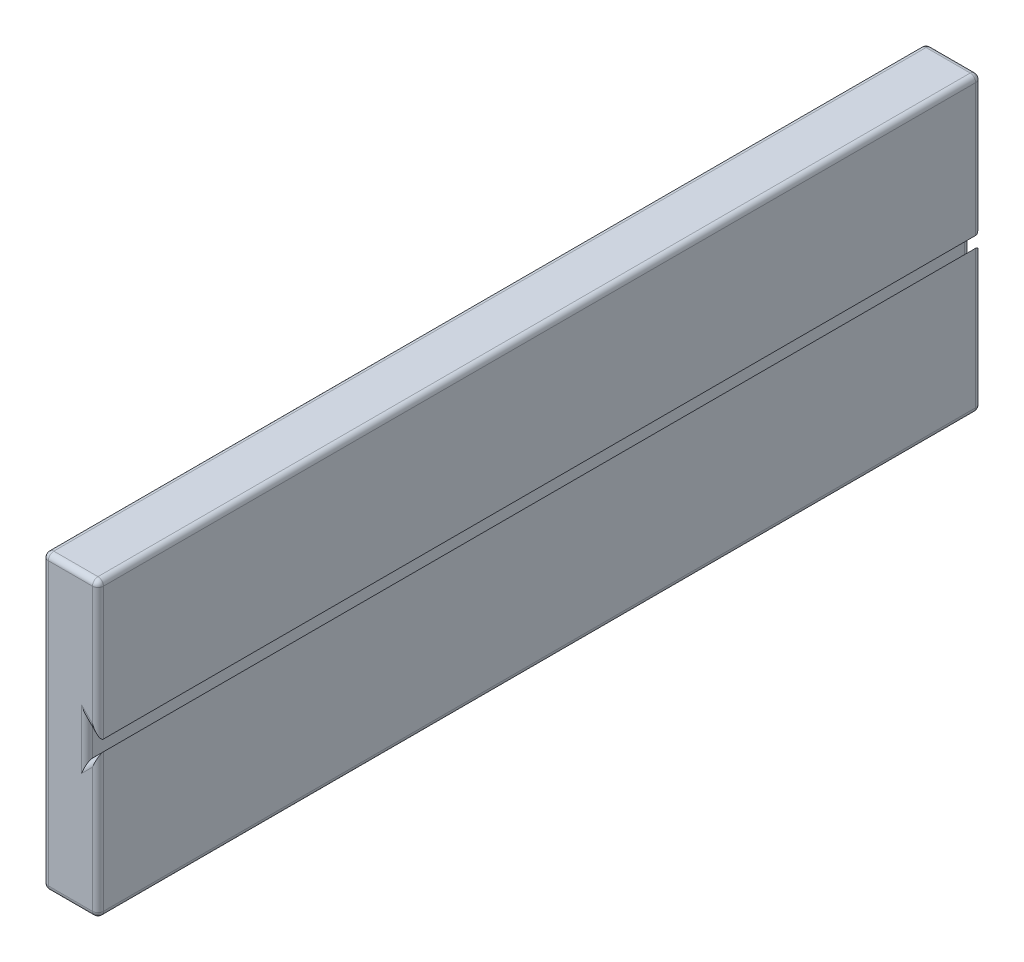
ISO-10303-21;
HEADER;
FILE_DESCRIPTION(('STEP AP214'),'2;1');
FILE_NAME('part.step','',(''),(''),'','','');
FILE_SCHEMA(('AUTOMOTIVE_DESIGN { 1 0 10303 214 1 1 1 1 }'));
ENDSEC;
DATA;
#1=APPLICATION_CONTEXT('core data for automotive mechanical design processes');
#2=APPLICATION_PROTOCOL_DEFINITION('international standard','automotive_design',2000,#1);
#3=PRODUCT_CONTEXT('',#1,'mechanical');
#4=PRODUCT('Part','Part','',(#3));
#5=PRODUCT_RELATED_PRODUCT_CATEGORY('part','',(#4));
#6=PRODUCT_DEFINITION_FORMATION('','',#4);
#7=PRODUCT_DEFINITION_CONTEXT('part definition',#1,'design');
#8=PRODUCT_DEFINITION('design','',#6,#7);
#9=PRODUCT_DEFINITION_SHAPE('','',#8);
#10=(LENGTH_UNIT() NAMED_UNIT(*) SI_UNIT(.MILLI.,.METRE.));
#11=(NAMED_UNIT(*) PLANE_ANGLE_UNIT() SI_UNIT($,.RADIAN.));
#12=(NAMED_UNIT(*) SI_UNIT($,.STERADIAN.) SOLID_ANGLE_UNIT());
#13=UNCERTAINTY_MEASURE_WITH_UNIT(LENGTH_MEASURE(1.E-05),#10,'distance_accuracy_value','');
#14=(GEOMETRIC_REPRESENTATION_CONTEXT(3) GLOBAL_UNCERTAINTY_ASSIGNED_CONTEXT((#13)) GLOBAL_UNIT_ASSIGNED_CONTEXT((#10,
#11,#12)) REPRESENTATION_CONTEXT('',''));
#15=CARTESIAN_POINT('',(0.,0.,0.));
#16=DIRECTION('',(0.,0.,1.));
#17=DIRECTION('',(1.,0.,0.));
#18=AXIS2_PLACEMENT_3D('',#15,#16,#17);
#19=CARTESIAN_POINT('',(10.,0.,0.));
#20=DIRECTION('',(-1.,0.,0.));
#21=DIRECTION('',(0.,0.,1.));
#22=AXIS2_PLACEMENT_3D('',#19,#20,#21);
#23=PLANE('',#22);
#24=DIRECTION('',(0.,0.,-1.));
#25=VECTOR('',#24,1.);
#26=CARTESIAN_POINT('',(10.,1.,0.));
#27=LINE('',#26,#25);
#28=CARTESIAN_POINT('',(10.,1.,-1.));
#29=VERTEX_POINT('',#28);
#30=CARTESIAN_POINT('',(10.,1.,-159.));
#31=VERTEX_POINT('',#30);
#32=EDGE_CURVE('E176',#29,#31,#27,.T.);
#33=ORIENTED_EDGE('',*,*,#32,.T.);
#34=DIRECTION('',(0.,1.,0.));
#35=VECTOR('',#34,1.);
#36=CARTESIAN_POINT('',(10.,0.,-159.));
#37=LINE('',#36,#35);
#38=CARTESIAN_POINT('',(10.,26.0254427708585,-159.));
#39=VERTEX_POINT('',#38);
#40=EDGE_CURVE('E171',#31,#39,#37,.T.);
#41=ORIENTED_EDGE('',*,*,#40,.T.);
#42=DIRECTION('',(0.,0.,1.));
#43=VECTOR('',#42,1.);
#44=CARTESIAN_POINT('',(10.,26.0254427708585,0.));
#45=LINE('',#44,#43);
#46=CARTESIAN_POINT('',(10.,26.0254427708585,-1.));
#47=VERTEX_POINT('',#46);
#48=EDGE_CURVE('E173',#39,#47,#45,.T.);
#49=ORIENTED_EDGE('',*,*,#48,.T.);
#50=DIRECTION('',(0.,-1.,0.));
#51=VECTOR('',#50,1.);
#52=CARTESIAN_POINT('',(10.,0.,-1.));
#53=LINE('',#52,#51);
#54=EDGE_CURVE('E190',#47,#29,#53,.T.);
#55=ORIENTED_EDGE('',*,*,#54,.T.);
#56=EDGE_LOOP('',(#33,#41,#49,#55));
#57=FACE_BOUND('',#56,.T.);
#58=ADVANCED_FACE('F34',(#57),#23,.F.);
#59=CARTESIAN_POINT('',(10.,0.,0.));
#60=DIRECTION('',(0.,0.,-1.));
#61=DIRECTION('',(-1.,0.,0.));
#62=AXIS2_PLACEMENT_3D('',#59,#60,#61);
#63=PLANE('',#62);
#64=DIRECTION('',(0.,1.,0.));
#65=VECTOR('',#64,1.);
#66=CARTESIAN_POINT('',(7.,0.,0.));
#67=LINE('',#66,#65);
#68=CARTESIAN_POINT('',(7.,21.6112292084854,0.));
#69=VERTEX_POINT('',#68);
#70=CARTESIAN_POINT('',(7.,32.4396563332316,0.));
#71=VERTEX_POINT('',#70);
#72=EDGE_CURVE('E357',#69,#71,#67,.T.);
#73=ORIENTED_EDGE('',*,*,#72,.T.);
#74=DIRECTION('',(0.707106781186548,-0.707106781186547,0.));
#75=VECTOR('',#74,1.);
#76=CARTESIAN_POINT('',(24.7198281666158,14.7198281666158,0.));
#77=LINE('',#76,#75);
#78=CARTESIAN_POINT('',(9.,30.4396563332316,0.));
#79=VERTEX_POINT('',#78);
#80=EDGE_CURVE('E359',#71,#79,#77,.T.);
#81=ORIENTED_EDGE('',*,*,#80,.T.);
#82=DIRECTION('',(0.,-1.,0.));
#83=VECTOR('',#82,1.);
#84=CARTESIAN_POINT('',(9.,0.,0.));
#85=LINE('',#84,#83);
#86=CARTESIAN_POINT('',(9.,52.,0.));
#87=VERTEX_POINT('',#86);
#88=EDGE_CURVE('E346',#79,#87,#85,.F.);
#89=ORIENTED_EDGE('',*,*,#88,.T.);
#90=DIRECTION('',(-1.,0.,0.));
#91=VECTOR('',#90,1.);
#92=CARTESIAN_POINT('',(10.,52.,0.));
#93=LINE('',#92,#91);
#94=CARTESIAN_POINT('',(0.999999999999999,52.,0.));
#95=VERTEX_POINT('',#94);
#96=EDGE_CURVE('E344',#87,#95,#93,.T.);
#97=ORIENTED_EDGE('',*,*,#96,.T.);
#98=DIRECTION('',(0.,-1.,0.));
#99=VECTOR('',#98,1.);
#100=CARTESIAN_POINT('',(0.999999999999999,0.,0.));
#101=LINE('',#100,#99);
#102=CARTESIAN_POINT('',(0.999999999999999,1.,0.));
#103=VERTEX_POINT('',#102);
#104=EDGE_CURVE('E348',#95,#103,#101,.T.);
#105=ORIENTED_EDGE('',*,*,#104,.T.);
#106=DIRECTION('',(-1.,0.,0.));
#107=VECTOR('',#106,1.);
#108=CARTESIAN_POINT('',(10.,1.,0.));
#109=LINE('',#108,#107);
#110=CARTESIAN_POINT('',(9.,1.,0.));
#111=VERTEX_POINT('',#110);
#112=EDGE_CURVE('E350',#103,#111,#109,.F.);
#113=ORIENTED_EDGE('',*,*,#112,.T.);
#114=DIRECTION('',(0.,-1.,0.));
#115=VECTOR('',#114,1.);
#116=CARTESIAN_POINT('',(9.,0.,0.));
#117=LINE('',#116,#115);
#118=CARTESIAN_POINT('',(9.,23.6112292084854,0.));
#119=VERTEX_POINT('',#118);
#120=EDGE_CURVE('E353',#111,#119,#117,.F.);
#121=ORIENTED_EDGE('',*,*,#120,.T.);
#122=DIRECTION('',(-0.707106781186548,-0.707106781186547,0.));
#123=VECTOR('',#122,1.);
#124=CARTESIAN_POINT('',(-2.30561460424269,12.3056146042427,0.));
#125=LINE('',#124,#123);
#126=EDGE_CURVE('E355',#119,#69,#125,.T.);
#127=ORIENTED_EDGE('',*,*,#126,.T.);
#128=EDGE_LOOP('',(#73,#81,#89,#97,#105,#113,#121,#127));
#129=FACE_BOUND('',#128,.T.);
#130=ADVANCED_FACE('F461',(#129),#63,.F.);
#131=CARTESIAN_POINT('',(10.,0.,0.));
#132=DIRECTION('',(0.,1.,0.));
#133=DIRECTION('',(0.,0.,1.));
#134=AXIS2_PLACEMENT_3D('',#131,#132,#133);
#135=PLANE('',#134);
#136=DIRECTION('',(0.,0.,-1.));
#137=VECTOR('',#136,1.);
#138=CARTESIAN_POINT('',(0.999999999999999,0.,-160.));
#139=LINE('',#138,#137);
#140=CARTESIAN_POINT('',(0.999999999999999,0.,-1.));
#141=VERTEX_POINT('',#140);
#142=CARTESIAN_POINT('',(0.999999999999999,0.,-159.));
#143=VERTEX_POINT('',#142);
#144=EDGE_CURVE('E298',#141,#143,#139,.T.);
#145=ORIENTED_EDGE('',*,*,#144,.T.);
#146=DIRECTION('',(-1.,0.,0.));
#147=VECTOR('',#146,1.);
#148=CARTESIAN_POINT('',(10.,0.,-159.));
#149=LINE('',#148,#147);
#150=CARTESIAN_POINT('',(9.,0.,-159.));
#151=VERTEX_POINT('',#150);
#152=EDGE_CURVE('E303',#143,#151,#149,.F.);
#153=ORIENTED_EDGE('',*,*,#152,.T.);
#154=DIRECTION('',(0.,0.,-1.));
#155=VECTOR('',#154,1.);
#156=CARTESIAN_POINT('',(9.,0.,0.));
#157=LINE('',#156,#155);
#158=CARTESIAN_POINT('',(9.,0.,-1.));
#159=VERTEX_POINT('',#158);
#160=EDGE_CURVE('E300',#151,#159,#157,.F.);
#161=ORIENTED_EDGE('',*,*,#160,.T.);
#162=DIRECTION('',(-1.,0.,0.));
#163=VECTOR('',#162,1.);
#164=CARTESIAN_POINT('',(10.,0.,-1.));
#165=LINE('',#164,#163);
#166=EDGE_CURVE('E180',#159,#141,#165,.T.);
#167=ORIENTED_EDGE('',*,*,#166,.T.);
#168=EDGE_LOOP('',(#145,#153,#161,#167));
#169=FACE_BOUND('',#168,.T.);
#170=ADVANCED_FACE('F391',(#169),#135,.F.);
#171=CARTESIAN_POINT('',(10.,0.,-160.));
#172=DIRECTION('',(0.,0.,1.));
#173=DIRECTION('',(1.,0.,0.));
#174=AXIS2_PLACEMENT_3D('',#171,#172,#173);
#175=PLANE('',#174);
#176=DIRECTION('',(0.,1.,0.));
#177=VECTOR('',#176,1.);
#178=CARTESIAN_POINT('',(9.,0.,-160.));
#179=LINE('',#178,#177);
#180=CARTESIAN_POINT('',(9.,23.6112292084854,-160.));
#181=VERTEX_POINT('',#180);
#182=CARTESIAN_POINT('',(9.,1.,-160.));
#183=VERTEX_POINT('',#182);
#184=EDGE_CURVE('E205',#181,#183,#179,.F.);
#185=ORIENTED_EDGE('',*,*,#184,.T.);
#186=DIRECTION('',(-1.,0.,0.));
#187=VECTOR('',#186,1.);
#188=CARTESIAN_POINT('',(10.,1.,-160.));
#189=LINE('',#188,#187);
#190=CARTESIAN_POINT('',(0.999999999999999,1.,-160.));
#191=VERTEX_POINT('',#190);
#192=EDGE_CURVE('E328',#183,#191,#189,.T.);
#193=ORIENTED_EDGE('',*,*,#192,.T.);
#194=DIRECTION('',(0.,1.,0.));
#195=VECTOR('',#194,1.);
#196=CARTESIAN_POINT('',(0.999999999999999,53.,-160.));
#197=LINE('',#196,#195);
#198=CARTESIAN_POINT('',(0.999999999999999,52.,-160.));
#199=VERTEX_POINT('',#198);
#200=EDGE_CURVE('E316',#191,#199,#197,.T.);
#201=ORIENTED_EDGE('',*,*,#200,.T.);
#202=DIRECTION('',(-1.,0.,0.));
#203=VECTOR('',#202,1.);
#204=CARTESIAN_POINT('',(10.,52.,-160.));
#205=LINE('',#204,#203);
#206=CARTESIAN_POINT('',(9.,52.,-160.));
#207=VERTEX_POINT('',#206);
#208=EDGE_CURVE('E314',#199,#207,#205,.F.);
#209=ORIENTED_EDGE('',*,*,#208,.T.);
#210=DIRECTION('',(0.,1.,0.));
#211=VECTOR('',#210,1.);
#212=CARTESIAN_POINT('',(9.,0.,-160.));
#213=LINE('',#212,#211);
#214=CARTESIAN_POINT('',(9.,30.4396563332316,-160.));
#215=VERTEX_POINT('',#214);
#216=EDGE_CURVE('E318',#207,#215,#213,.F.);
#217=ORIENTED_EDGE('',*,*,#216,.T.);
#218=DIRECTION('',(-0.707106781186548,0.707106781186547,0.));
#219=VECTOR('',#218,1.);
#220=CARTESIAN_POINT('',(24.7198281666158,14.7198281666158,-160.));
#221=LINE('',#220,#219);
#222=CARTESIAN_POINT('',(7.,32.4396563332316,-160.));
#223=VERTEX_POINT('',#222);
#224=EDGE_CURVE('E320',#215,#223,#221,.T.);
#225=ORIENTED_EDGE('',*,*,#224,.T.);
#226=DIRECTION('',(0.,-1.,0.));
#227=VECTOR('',#226,1.);
#228=CARTESIAN_POINT('',(7.,0.,-160.));
#229=LINE('',#228,#227);
#230=CARTESIAN_POINT('',(7.,21.6112292084854,-160.));
#231=VERTEX_POINT('',#230);
#232=EDGE_CURVE('E323',#223,#231,#229,.T.);
#233=ORIENTED_EDGE('',*,*,#232,.T.);
#234=DIRECTION('',(0.707106781186548,0.707106781186547,0.));
#235=VECTOR('',#234,1.);
#236=CARTESIAN_POINT('',(-2.30561460424269,12.3056146042427,-160.));
#237=LINE('',#236,#235);
#238=EDGE_CURVE('E325',#231,#181,#237,.T.);
#239=ORIENTED_EDGE('',*,*,#238,.T.);
#240=EDGE_LOOP('',(#185,#193,#201,#209,#217,#225,#233,#239));
#241=FACE_BOUND('',#240,.T.);
#242=ADVANCED_FACE('F405',(#241),#175,.F.);
#243=CARTESIAN_POINT('',(10.,53.,0.));
#244=DIRECTION('',(0.,-1.,0.));
#245=DIRECTION('',(0.,0.,-1.));
#246=AXIS2_PLACEMENT_3D('',#243,#244,#245);
#247=PLANE('',#246);
#248=DIRECTION('',(0.,0.,1.));
#249=VECTOR('',#248,1.);
#250=CARTESIAN_POINT('',(9.,53.,0.));
#251=LINE('',#250,#249);
#252=CARTESIAN_POINT('',(9.,53.,-1.));
#253=VERTEX_POINT('',#252);
#254=CARTESIAN_POINT('',(9.,53.,-159.));
#255=VERTEX_POINT('',#254);
#256=EDGE_CURVE('E43',#253,#255,#251,.F.);
#257=ORIENTED_EDGE('',*,*,#256,.T.);
#258=DIRECTION('',(-1.,0.,0.));
#259=VECTOR('',#258,1.);
#260=CARTESIAN_POINT('',(10.,53.,-159.));
#261=LINE('',#260,#259);
#262=CARTESIAN_POINT('',(0.999999999999999,53.,-159.));
#263=VERTEX_POINT('',#262);
#264=EDGE_CURVE('E11',#255,#263,#261,.T.);
#265=ORIENTED_EDGE('',*,*,#264,.T.);
#266=DIRECTION('',(0.,0.,1.));
#267=VECTOR('',#266,1.);
#268=CARTESIAN_POINT('',(0.999999999999999,53.,0.));
#269=LINE('',#268,#267);
#270=CARTESIAN_POINT('',(0.999999999999999,53.,-1.));
#271=VERTEX_POINT('',#270);
#272=EDGE_CURVE('E361',#263,#271,#269,.T.);
#273=ORIENTED_EDGE('',*,*,#272,.T.);
#274=DIRECTION('',(-1.,0.,0.));
#275=VECTOR('',#274,1.);
#276=CARTESIAN_POINT('',(10.,53.,-1.));
#277=LINE('',#276,#275);
#278=EDGE_CURVE('E54',#271,#253,#277,.F.);
#279=ORIENTED_EDGE('',*,*,#278,.T.);
#280=EDGE_LOOP('',(#257,#265,#273,#279));
#281=FACE_BOUND('',#280,.T.);
#282=ADVANCED_FACE('F488',(#281),#247,.F.);
#283=DIRECTION('',(0.,0.,-1.));
#284=VECTOR('',#283,1.);
#285=CARTESIAN_POINT('',(10.,28.0254427708585,0.));
#286=LINE('',#285,#284);
#287=CARTESIAN_POINT('',(10.,28.0254427708585,-1.));
#288=VERTEX_POINT('',#287);
#289=CARTESIAN_POINT('',(10.,28.0254427708585,-159.));
#290=VERTEX_POINT('',#289);
#291=EDGE_CURVE('E191',#288,#290,#286,.T.);
#292=ORIENTED_EDGE('',*,*,#291,.T.);
#293=DIRECTION('',(0.,1.,0.));
#294=VECTOR('',#293,1.);
#295=CARTESIAN_POINT('',(10.,0.,-159.));
#296=LINE('',#295,#294);
#297=CARTESIAN_POINT('',(10.,52.,-159.));
#298=VERTEX_POINT('',#297);
#299=EDGE_CURVE('E338',#290,#298,#296,.T.);
#300=ORIENTED_EDGE('',*,*,#299,.T.);
#301=DIRECTION('',(0.,0.,1.));
#302=VECTOR('',#301,1.);
#303=CARTESIAN_POINT('',(10.,52.,0.));
#304=LINE('',#303,#302);
#305=CARTESIAN_POINT('',(10.,52.,-1.));
#306=VERTEX_POINT('',#305);
#307=EDGE_CURVE('E334',#298,#306,#304,.T.);
#308=ORIENTED_EDGE('',*,*,#307,.T.);
#309=DIRECTION('',(0.,-1.,0.));
#310=VECTOR('',#309,1.);
#311=CARTESIAN_POINT('',(10.,0.,-1.));
#312=LINE('',#311,#310);
#313=EDGE_CURVE('E336',#306,#288,#312,.T.);
#314=ORIENTED_EDGE('',*,*,#313,.T.);
#315=EDGE_LOOP('',(#292,#300,#308,#314));
#316=FACE_BOUND('',#315,.T.);
#317=ADVANCED_FACE('F480',(#316),#23,.F.);
#318=CARTESIAN_POINT('',(0.,0.,0.));
#319=DIRECTION('',(-1.,0.,0.));
#320=DIRECTION('',(0.,0.,1.));
#321=AXIS2_PLACEMENT_3D('',#318,#319,#320);
#322=PLANE('',#321);
#323=DIRECTION('',(0.,1.,0.));
#324=VECTOR('',#323,1.);
#325=CARTESIAN_POINT('',(0.,0.,-159.));
#326=LINE('',#325,#324);
#327=CARTESIAN_POINT('',(0.,52.,-159.));
#328=VERTEX_POINT('',#327);
#329=CARTESIAN_POINT('',(0.,1.,-159.));
#330=VERTEX_POINT('',#329);
#331=EDGE_CURVE('E309',#328,#330,#326,.F.);
#332=ORIENTED_EDGE('',*,*,#331,.T.);
#333=DIRECTION('',(0.,0.,-1.));
#334=VECTOR('',#333,1.);
#335=CARTESIAN_POINT('',(0.,1.,0.));
#336=LINE('',#335,#334);
#337=CARTESIAN_POINT('',(0.,1.,-1.));
#338=VERTEX_POINT('',#337);
#339=EDGE_CURVE('E311',#330,#338,#336,.F.);
#340=ORIENTED_EDGE('',*,*,#339,.T.);
#341=DIRECTION('',(0.,-1.,0.));
#342=VECTOR('',#341,1.);
#343=CARTESIAN_POINT('',(0.,53.,-1.));
#344=LINE('',#343,#342);
#345=CARTESIAN_POINT('',(0.,52.,-1.));
#346=VERTEX_POINT('',#345);
#347=EDGE_CURVE('E307',#338,#346,#344,.F.);
#348=ORIENTED_EDGE('',*,*,#347,.T.);
#349=DIRECTION('',(0.,0.,1.));
#350=VECTOR('',#349,1.);
#351=CARTESIAN_POINT('',(0.,52.,-160.));
#352=LINE('',#351,#350);
#353=EDGE_CURVE('E305',#346,#328,#352,.F.);
#354=ORIENTED_EDGE('',*,*,#353,.T.);
#355=EDGE_LOOP('',(#332,#340,#348,#354));
#356=FACE_BOUND('',#355,.T.);
#357=ADVANCED_FACE('F421',(#356),#322,.T.);
#358=CARTESIAN_POINT('',(8.,24.0254427708585,211.057604695969));
#359=DIRECTION('',(-1.,0.,0.));
#360=DIRECTION('',(0.,0.,1.));
#361=AXIS2_PLACEMENT_3D('',#358,#359,#360);
#362=PLANE('',#361);
#363=DIRECTION('',(0.,0.,-1.));
#364=VECTOR('',#363,1.);
#365=CARTESIAN_POINT('',(8.,24.0254427708585,211.057604695969));
#366=LINE('',#365,#364);
#367=CARTESIAN_POINT('',(8.,24.0254427708585,-1.));
#368=VERTEX_POINT('',#367);
#369=CARTESIAN_POINT('',(8.,24.0254427708585,-159.));
#370=VERTEX_POINT('',#369);
#371=EDGE_CURVE('E286',#368,#370,#366,.T.);
#372=ORIENTED_EDGE('',*,*,#371,.T.);
#373=DIRECTION('',(0.,-1.,0.));
#374=VECTOR('',#373,1.);
#375=CARTESIAN_POINT('',(8.,24.0254427708585,-159.));
#376=LINE('',#375,#374);
#377=CARTESIAN_POINT('',(8.,30.0254427708585,-159.));
#378=VERTEX_POINT('',#377);
#379=EDGE_CURVE('E342',#370,#378,#376,.F.);
#380=ORIENTED_EDGE('',*,*,#379,.T.);
#381=DIRECTION('',(0.,0.,-1.));
#382=VECTOR('',#381,1.);
#383=CARTESIAN_POINT('',(8.,30.0254427708585,211.057604695969));
#384=LINE('',#383,#382);
#385=CARTESIAN_POINT('',(8.,30.0254427708585,-1.));
#386=VERTEX_POINT('',#385);
#387=EDGE_CURVE('E280',#386,#378,#384,.T.);
#388=ORIENTED_EDGE('',*,*,#387,.F.);
#389=DIRECTION('',(0.,1.,0.));
#390=VECTOR('',#389,1.);
#391=CARTESIAN_POINT('',(8.,24.0254427708585,-1.));
#392=LINE('',#391,#390);
#393=EDGE_CURVE('E202',#386,#368,#392,.F.);
#394=ORIENTED_EDGE('',*,*,#393,.T.);
#395=EDGE_LOOP('',(#372,#380,#388,#394));
#396=FACE_BOUND('',#395,.T.);
#397=ADVANCED_FACE('F447',(#396),#362,.F.);
#398=CARTESIAN_POINT('',(10.,26.0254427708585,211.057604695969));
#399=DIRECTION('',(0.707106781186547,-0.707106781186548,0.));
#400=DIRECTION('',(0.707106781186548,0.707106781186547,0.));
#401=AXIS2_PLACEMENT_3D('',#398,#399,#400);
#402=PLANE('',#401);
#403=ORIENTED_EDGE('',*,*,#48,.F.);
#404=DIRECTION('',(0.707106781186548,0.707106781186547,0.));
#405=VECTOR('',#404,1.);
#406=CARTESIAN_POINT('',(10.,26.0254427708585,-159.));
#407=LINE('',#406,#405);
#408=EDGE_CURVE('E186',#39,#370,#407,.F.);
#409=ORIENTED_EDGE('',*,*,#408,.T.);
#410=ORIENTED_EDGE('',*,*,#371,.F.);
#411=DIRECTION('',(-0.707106781186548,-0.707106781186547,0.));
#412=VECTOR('',#411,1.);
#413=CARTESIAN_POINT('',(10.,26.0254427708585,-1.));
#414=LINE('',#413,#412);
#415=EDGE_CURVE('E189',#368,#47,#414,.F.);
#416=ORIENTED_EDGE('',*,*,#415,.T.);
#417=EDGE_LOOP('',(#403,#409,#410,#416));
#418=FACE_BOUND('',#417,.T.);
#419=ADVANCED_FACE('F184',(#418),#402,.F.);
#420=CARTESIAN_POINT('',(8.,30.0254427708585,211.057604695969));
#421=DIRECTION('',(0.707106781186547,0.707106781186548,0.));
#422=DIRECTION('',(-0.707106781186548,0.707106781186547,0.));
#423=AXIS2_PLACEMENT_3D('',#420,#421,#422);
#424=PLANE('',#423);
#425=ORIENTED_EDGE('',*,*,#387,.T.);
#426=DIRECTION('',(-0.707106781186548,0.707106781186547,0.));
#427=VECTOR('',#426,1.);
#428=CARTESIAN_POINT('',(8.,30.0254427708585,-159.));
#429=LINE('',#428,#427);
#430=EDGE_CURVE('E332',#378,#290,#429,.F.);
#431=ORIENTED_EDGE('',*,*,#430,.T.);
#432=ORIENTED_EDGE('',*,*,#291,.F.);
#433=DIRECTION('',(0.707106781186548,-0.707106781186547,0.));
#434=VECTOR('',#433,1.);
#435=CARTESIAN_POINT('',(8.,30.0254427708585,-1.));
#436=LINE('',#435,#434);
#437=EDGE_CURVE('E330',#288,#386,#436,.F.);
#438=ORIENTED_EDGE('',*,*,#437,.T.);
#439=EDGE_LOOP('',(#425,#431,#432,#438));
#440=FACE_BOUND('',#439,.T.);
#441=ADVANCED_FACE('F499',(#440),#424,.F.);
#442=CARTESIAN_POINT('',(9.,52.,0.));
#443=DIRECTION('',(0.,0.,1.));
#444=DIRECTION('',(1.,0.,0.));
#445=AXIS2_PLACEMENT_3D('',#442,#443,#444);
#446=CYLINDRICAL_SURFACE('',#445,1.);
#447=CARTESIAN_POINT('',(9.,52.,-1.));
#448=DIRECTION('',(0.,0.,1.));
#449=DIRECTION('',(1.,0.,0.));
#450=AXIS2_PLACEMENT_3D('',#447,#448,#449);
#451=CIRCLE('',#450,1.);
#452=EDGE_CURVE('E38',#306,#253,#451,.T.);
#453=ORIENTED_EDGE('',*,*,#452,.F.);
#454=ORIENTED_EDGE('',*,*,#307,.F.);
#455=CARTESIAN_POINT('',(9.,52.,-159.));
#456=DIRECTION('',(0.,0.,-1.));
#457=DIRECTION('',(-1.,0.,0.));
#458=AXIS2_PLACEMENT_3D('',#455,#456,#457);
#459=CIRCLE('',#458,1.);
#460=EDGE_CURVE('E274',#255,#298,#459,.T.);
#461=ORIENTED_EDGE('',*,*,#460,.F.);
#462=ORIENTED_EDGE('',*,*,#256,.F.);
#463=EDGE_LOOP('',(#453,#454,#461,#462));
#464=FACE_BOUND('',#463,.T.);
#465=ADVANCED_FACE('F36',(#464),#446,.T.);
#466=CARTESIAN_POINT('',(9.,52.,-1.));
#467=DIRECTION('',(0.,0.,1.));
#468=DIRECTION('',(1.,0.,0.));
#469=AXIS2_PLACEMENT_3D('',#466,#467,#468);
#470=SPHERICAL_SURFACE('',#469,1.);
#471=CARTESIAN_POINT('',(9.,52.,-1.));
#472=DIRECTION('',(0.,1.,0.));
#473=DIRECTION('',(0.,0.,1.));
#474=AXIS2_PLACEMENT_3D('',#471,#472,#473);
#475=CIRCLE('',#474,1.);
#476=EDGE_CURVE('E269',#306,#87,#475,.F.);
#477=ORIENTED_EDGE('',*,*,#476,.F.);
#478=ORIENTED_EDGE('',*,*,#452,.T.);
#479=CARTESIAN_POINT('',(9.,52.,-1.));
#480=DIRECTION('',(1.,0.,0.));
#481=DIRECTION('',(0.,0.,-1.));
#482=AXIS2_PLACEMENT_3D('',#479,#480,#481);
#483=CIRCLE('',#482,1.);
#484=EDGE_CURVE('E272',#87,#253,#483,.F.);
#485=ORIENTED_EDGE('',*,*,#484,.F.);
#486=EDGE_LOOP('',(#477,#478,#485));
#487=FACE_BOUND('',#486,.T.);
#488=ADVANCED_FACE('F507',(#487),#470,.T.);
#489=CARTESIAN_POINT('',(9.,52.,-159.));
#490=DIRECTION('',(0.,0.,1.));
#491=DIRECTION('',(1.,0.,0.));
#492=AXIS2_PLACEMENT_3D('',#489,#490,#491);
#493=SPHERICAL_SURFACE('',#492,1.);
#494=CARTESIAN_POINT('',(9.,52.,-159.));
#495=DIRECTION('',(1.,0.,0.));
#496=DIRECTION('',(0.,0.,-1.));
#497=AXIS2_PLACEMENT_3D('',#494,#495,#496);
#498=CIRCLE('',#497,1.);
#499=EDGE_CURVE('E263',#255,#207,#498,.F.);
#500=ORIENTED_EDGE('',*,*,#499,.F.);
#501=ORIENTED_EDGE('',*,*,#460,.T.);
#502=CARTESIAN_POINT('',(9.,52.,-159.));
#503=DIRECTION('',(0.,1.,0.));
#504=DIRECTION('',(0.,0.,1.));
#505=AXIS2_PLACEMENT_3D('',#502,#503,#504);
#506=CIRCLE('',#505,1.);
#507=EDGE_CURVE('E266',#207,#298,#506,.F.);
#508=ORIENTED_EDGE('',*,*,#507,.F.);
#509=EDGE_LOOP('',(#500,#501,#508));
#510=FACE_BOUND('',#509,.T.);
#511=ADVANCED_FACE('F531',(#510),#493,.T.);
#512=CARTESIAN_POINT('',(10.,52.,-1.));
#513=DIRECTION('',(-1.,0.,0.));
#514=DIRECTION('',(0.,0.,1.));
#515=AXIS2_PLACEMENT_3D('',#512,#513,#514);
#516=CYLINDRICAL_SURFACE('',#515,1.);
#517=ORIENTED_EDGE('',*,*,#484,.T.);
#518=ORIENTED_EDGE('',*,*,#278,.F.);
#519=CARTESIAN_POINT('',(0.999999999999999,52.,-1.));
#520=DIRECTION('',(-1.,0.,0.));
#521=DIRECTION('',(0.,0.,1.));
#522=AXIS2_PLACEMENT_3D('',#519,#520,#521);
#523=CIRCLE('',#522,1.);
#524=EDGE_CURVE('E257',#95,#271,#523,.T.);
#525=ORIENTED_EDGE('',*,*,#524,.F.);
#526=ORIENTED_EDGE('',*,*,#96,.F.);
#527=EDGE_LOOP('',(#517,#518,#525,#526));
#528=FACE_BOUND('',#527,.T.);
#529=ADVANCED_FACE('F509',(#528),#516,.T.);
#530=CARTESIAN_POINT('',(9.,0.,-1.));
#531=DIRECTION('',(0.,-1.,0.));
#532=DIRECTION('',(0.,0.,-1.));
#533=AXIS2_PLACEMENT_3D('',#530,#531,#532);
#534=CYLINDRICAL_SURFACE('',#533,1.);
#535=ORIENTED_EDGE('',*,*,#476,.T.);
#536=ORIENTED_EDGE('',*,*,#88,.F.);
#537=CARTESIAN_POINT('',(9.,30.4396563332316,-1.));
#538=DIRECTION('',(0.923879532511287,0.38268343236509,0.));
#539=DIRECTION('',(0.38268343236509,-0.923879532511287,0.));
#540=AXIS2_PLACEMENT_3D('',#537,#538,#539);
#541=ELLIPSE('',#540,2.61312592975275,1.);
#542=EDGE_CURVE('E254',#288,#79,#541,.F.);
#543=ORIENTED_EDGE('',*,*,#542,.F.);
#544=ORIENTED_EDGE('',*,*,#313,.F.);
#545=EDGE_LOOP('',(#535,#536,#543,#544));
#546=FACE_BOUND('',#545,.T.);
#547=ADVANCED_FACE('F503',(#546),#534,.T.);
#548=CARTESIAN_POINT('',(9.,0.,-159.));
#549=DIRECTION('',(0.,1.,0.));
#550=DIRECTION('',(0.,0.,1.));
#551=AXIS2_PLACEMENT_3D('',#548,#549,#550);
#552=CYLINDRICAL_SURFACE('',#551,1.);
#553=ORIENTED_EDGE('',*,*,#507,.T.);
#554=ORIENTED_EDGE('',*,*,#299,.F.);
#555=CARTESIAN_POINT('',(9.,30.4396563332316,-159.));
#556=DIRECTION('',(0.923879532511287,0.38268343236509,0.));
#557=DIRECTION('',(-0.38268343236509,0.923879532511287,0.));
#558=AXIS2_PLACEMENT_3D('',#555,#556,#557);
#559=ELLIPSE('',#558,2.61312592975275,1.);
#560=EDGE_CURVE('E251',#215,#290,#559,.F.);
#561=ORIENTED_EDGE('',*,*,#560,.F.);
#562=ORIENTED_EDGE('',*,*,#216,.F.);
#563=EDGE_LOOP('',(#553,#554,#561,#562));
#564=FACE_BOUND('',#563,.T.);
#565=ADVANCED_FACE('F439',(#564),#552,.T.);
#566=CARTESIAN_POINT('',(10.,52.,-159.));
#567=DIRECTION('',(-1.,0.,0.));
#568=DIRECTION('',(0.,0.,1.));
#569=AXIS2_PLACEMENT_3D('',#566,#567,#568);
#570=CYLINDRICAL_SURFACE('',#569,1.);
#571=ORIENTED_EDGE('',*,*,#499,.T.);
#572=ORIENTED_EDGE('',*,*,#208,.F.);
#573=CARTESIAN_POINT('',(0.999999999999999,52.,-159.));
#574=DIRECTION('',(-1.,0.,0.));
#575=DIRECTION('',(0.,0.,1.));
#576=AXIS2_PLACEMENT_3D('',#573,#574,#575);
#577=CIRCLE('',#576,1.);
#578=EDGE_CURVE('E248',#263,#199,#577,.T.);
#579=ORIENTED_EDGE('',*,*,#578,.F.);
#580=ORIENTED_EDGE('',*,*,#264,.F.);
#581=EDGE_LOOP('',(#571,#572,#579,#580));
#582=FACE_BOUND('',#581,.T.);
#583=ADVANCED_FACE('F433',(#582),#570,.T.);
#584=CARTESIAN_POINT('',(0.999999999999999,52.,0.));
#585=DIRECTION('',(0.,0.,-1.));
#586=DIRECTION('',(-1.,0.,0.));
#587=AXIS2_PLACEMENT_3D('',#584,#585,#586);
#588=CYLINDRICAL_SURFACE('',#587,1.);
#589=CARTESIAN_POINT('',(0.999999999999999,52.,-1.));
#590=DIRECTION('',(0.,0.,1.));
#591=DIRECTION('',(1.,0.,0.));
#592=AXIS2_PLACEMENT_3D('',#589,#590,#591);
#593=CIRCLE('',#592,1.);
#594=EDGE_CURVE('E260',#271,#346,#593,.T.);
#595=ORIENTED_EDGE('',*,*,#594,.F.);
#596=ORIENTED_EDGE('',*,*,#272,.F.);
#597=CARTESIAN_POINT('',(1.,52.,-159.));
#598=DIRECTION('',(0.,0.,-1.));
#599=DIRECTION('',(-1.,0.,0.));
#600=AXIS2_PLACEMENT_3D('',#597,#598,#599);
#601=CIRCLE('',#600,1.);
#602=EDGE_CURVE('E246',#328,#263,#601,.T.);
#603=ORIENTED_EDGE('',*,*,#602,.F.);
#604=ORIENTED_EDGE('',*,*,#353,.F.);
#605=EDGE_LOOP('',(#595,#596,#603,#604));
#606=FACE_BOUND('',#605,.T.);
#607=ADVANCED_FACE('F427',(#606),#588,.T.);
#608=CARTESIAN_POINT('',(1.,52.,-1.));
#609=DIRECTION('',(0.,0.,1.));
#610=DIRECTION('',(1.,0.,0.));
#611=AXIS2_PLACEMENT_3D('',#608,#609,#610);
#612=SPHERICAL_SURFACE('',#611,1.);
#613=ORIENTED_EDGE('',*,*,#524,.T.);
#614=ORIENTED_EDGE('',*,*,#594,.T.);
#615=CARTESIAN_POINT('',(1.,52.,-1.));
#616=DIRECTION('',(0.,1.,0.));
#617=DIRECTION('',(0.,0.,1.));
#618=AXIS2_PLACEMENT_3D('',#615,#616,#617);
#619=CIRCLE('',#618,1.);
#620=EDGE_CURVE('E243',#95,#346,#619,.F.);
#621=ORIENTED_EDGE('',*,*,#620,.F.);
#622=EDGE_LOOP('',(#613,#614,#621));
#623=FACE_BOUND('',#622,.T.);
#624=ADVANCED_FACE('F512',(#623),#612,.T.);
#625=CARTESIAN_POINT('',(24.7198281666158,14.7198281666158,-1.));
#626=DIRECTION('',(0.707106781186548,-0.707106781186547,0.));
#627=DIRECTION('',(0.707106781186547,0.707106781186548,0.));
#628=AXIS2_PLACEMENT_3D('',#625,#626,#627);
#629=CYLINDRICAL_SURFACE('',#628,1.);
#630=ORIENTED_EDGE('',*,*,#542,.T.);
#631=ORIENTED_EDGE('',*,*,#80,.F.);
#632=CARTESIAN_POINT('',(7.,32.4396563332316,-1.));
#633=DIRECTION('',(0.923879532511287,0.38268343236509,0.));
#634=DIRECTION('',(0.38268343236509,-0.923879532511287,0.));
#635=AXIS2_PLACEMENT_3D('',#632,#633,#634);
#636=ELLIPSE('',#635,2.61312592975275,1.);
#637=EDGE_CURVE('E240',#386,#71,#636,.F.);
#638=ORIENTED_EDGE('',*,*,#637,.F.);
#639=ORIENTED_EDGE('',*,*,#437,.F.);
#640=EDGE_LOOP('',(#630,#631,#638,#639));
#641=FACE_BOUND('',#640,.T.);
#642=ADVANCED_FACE('F506',(#641),#629,.T.);
#643=CARTESIAN_POINT('',(24.7198281666158,14.7198281666158,-159.));
#644=DIRECTION('',(-0.707106781186548,0.707106781186547,0.));
#645=DIRECTION('',(-0.707106781186547,-0.707106781186548,0.));
#646=AXIS2_PLACEMENT_3D('',#643,#644,#645);
#647=CYLINDRICAL_SURFACE('',#646,1.);
#648=ORIENTED_EDGE('',*,*,#560,.T.);
#649=ORIENTED_EDGE('',*,*,#430,.F.);
#650=CARTESIAN_POINT('',(7.,32.4396563332316,-159.));
#651=DIRECTION('',(-0.923879532511287,-0.38268343236509,0.));
#652=DIRECTION('',(-0.38268343236509,0.923879532511287,0.));
#653=AXIS2_PLACEMENT_3D('',#650,#651,#652);
#654=ELLIPSE('',#653,2.61312592975275,1.);
#655=EDGE_CURVE('E237',#223,#378,#654,.T.);
#656=ORIENTED_EDGE('',*,*,#655,.F.);
#657=ORIENTED_EDGE('',*,*,#224,.F.);
#658=EDGE_LOOP('',(#648,#649,#656,#657));
#659=FACE_BOUND('',#658,.T.);
#660=ADVANCED_FACE('F442',(#659),#647,.T.);
#661=CARTESIAN_POINT('',(1.,52.,-159.));
#662=DIRECTION('',(0.,0.,1.));
#663=DIRECTION('',(1.,0.,0.));
#664=AXIS2_PLACEMENT_3D('',#661,#662,#663);
#665=SPHERICAL_SURFACE('',#664,1.);
#666=ORIENTED_EDGE('',*,*,#602,.T.);
#667=ORIENTED_EDGE('',*,*,#578,.T.);
#668=CARTESIAN_POINT('',(0.999999999999999,52.,-159.));
#669=DIRECTION('',(0.,1.,0.));
#670=DIRECTION('',(0.,0.,1.));
#671=AXIS2_PLACEMENT_3D('',#668,#669,#670);
#672=CIRCLE('',#671,1.);
#673=EDGE_CURVE('E234',#328,#199,#672,.F.);
#674=ORIENTED_EDGE('',*,*,#673,.F.);
#675=EDGE_LOOP('',(#666,#667,#674));
#676=FACE_BOUND('',#675,.T.);
#677=ADVANCED_FACE('F430',(#676),#665,.T.);
#678=CARTESIAN_POINT('',(0.999999999999999,0.,-1.));
#679=DIRECTION('',(0.,1.,0.));
#680=DIRECTION('',(0.,0.,1.));
#681=AXIS2_PLACEMENT_3D('',#678,#679,#680);
#682=CYLINDRICAL_SURFACE('',#681,1.);
#683=ORIENTED_EDGE('',*,*,#620,.T.);
#684=ORIENTED_EDGE('',*,*,#347,.F.);
#685=CARTESIAN_POINT('',(0.999999999999999,1.,-1.));
#686=DIRECTION('',(0.,-1.,0.));
#687=DIRECTION('',(0.,0.,-1.));
#688=AXIS2_PLACEMENT_3D('',#685,#686,#687);
#689=CIRCLE('',#688,1.);
#690=EDGE_CURVE('E229',#103,#338,#689,.T.);
#691=ORIENTED_EDGE('',*,*,#690,.F.);
#692=ORIENTED_EDGE('',*,*,#104,.F.);
#693=EDGE_LOOP('',(#683,#684,#691,#692));
#694=FACE_BOUND('',#693,.T.);
#695=ADVANCED_FACE('F467',(#694),#682,.T.);
#696=CARTESIAN_POINT('',(7.,0.,-1.));
#697=DIRECTION('',(0.,1.,0.));
#698=DIRECTION('',(0.,0.,1.));
#699=AXIS2_PLACEMENT_3D('',#696,#697,#698);
#700=CYLINDRICAL_SURFACE('',#699,1.);
#701=ORIENTED_EDGE('',*,*,#637,.T.);
#702=ORIENTED_EDGE('',*,*,#72,.F.);
#703=CARTESIAN_POINT('',(7.,21.6112292084854,-1.));
#704=DIRECTION('',(-0.923879532511287,0.38268343236509,0.));
#705=DIRECTION('',(0.38268343236509,0.923879532511287,0.));
#706=AXIS2_PLACEMENT_3D('',#703,#704,#705);
#707=ELLIPSE('',#706,2.61312592975275,1.);
#708=EDGE_CURVE('E226',#368,#69,#707,.F.);
#709=ORIENTED_EDGE('',*,*,#708,.F.);
#710=ORIENTED_EDGE('',*,*,#393,.F.);
#711=EDGE_LOOP('',(#701,#702,#709,#710));
#712=FACE_BOUND('',#711,.T.);
#713=ADVANCED_FACE('F453',(#712),#700,.T.);
#714=CARTESIAN_POINT('',(7.,0.,-159.));
#715=DIRECTION('',(0.,-1.,0.));
#716=DIRECTION('',(0.,0.,-1.));
#717=AXIS2_PLACEMENT_3D('',#714,#715,#716);
#718=CYLINDRICAL_SURFACE('',#717,1.);
#719=ORIENTED_EDGE('',*,*,#655,.T.);
#720=ORIENTED_EDGE('',*,*,#379,.F.);
#721=CARTESIAN_POINT('',(7.,21.6112292084854,-159.));
#722=DIRECTION('',(0.923879532511287,-0.38268343236509,0.));
#723=DIRECTION('',(0.38268343236509,0.923879532511287,0.));
#724=AXIS2_PLACEMENT_3D('',#721,#722,#723);
#725=ELLIPSE('',#724,2.61312592975275,1.);
#726=EDGE_CURVE('E201',#231,#370,#725,.T.);
#727=ORIENTED_EDGE('',*,*,#726,.F.);
#728=ORIENTED_EDGE('',*,*,#232,.F.);
#729=EDGE_LOOP('',(#719,#720,#727,#728));
#730=FACE_BOUND('',#729,.T.);
#731=ADVANCED_FACE('F445',(#730),#718,.T.);
#732=CARTESIAN_POINT('',(0.999999999999999,0.,-159.));
#733=DIRECTION('',(0.,-1.,0.));
#734=DIRECTION('',(0.,0.,-1.));
#735=AXIS2_PLACEMENT_3D('',#732,#733,#734);
#736=CYLINDRICAL_SURFACE('',#735,1.);
#737=ORIENTED_EDGE('',*,*,#673,.T.);
#738=ORIENTED_EDGE('',*,*,#200,.F.);
#739=CARTESIAN_POINT('',(1.,1.,-159.));
#740=DIRECTION('',(0.,-1.,0.));
#741=DIRECTION('',(0.,0.,-1.));
#742=AXIS2_PLACEMENT_3D('',#739,#740,#741);
#743=CIRCLE('',#742,1.);
#744=EDGE_CURVE('E222',#330,#191,#743,.T.);
#745=ORIENTED_EDGE('',*,*,#744,.F.);
#746=ORIENTED_EDGE('',*,*,#331,.F.);
#747=EDGE_LOOP('',(#737,#738,#745,#746));
#748=FACE_BOUND('',#747,.T.);
#749=ADVANCED_FACE('F409',(#748),#736,.T.);
#750=CARTESIAN_POINT('',(0.999999999999999,1.,0.));
#751=DIRECTION('',(0.,0.,1.));
#752=DIRECTION('',(1.,0.,0.));
#753=AXIS2_PLACEMENT_3D('',#750,#751,#752);
#754=CYLINDRICAL_SURFACE('',#753,1.);
#755=CARTESIAN_POINT('',(1.,1.,-1.));
#756=DIRECTION('',(0.,0.,1.));
#757=DIRECTION('',(1.,0.,0.));
#758=AXIS2_PLACEMENT_3D('',#755,#756,#757);
#759=CIRCLE('',#758,1.);
#760=EDGE_CURVE('E231',#338,#141,#759,.T.);
#761=ORIENTED_EDGE('',*,*,#760,.F.);
#762=ORIENTED_EDGE('',*,*,#339,.F.);
#763=CARTESIAN_POINT('',(0.999999999999999,1.,-159.));
#764=DIRECTION('',(0.,0.,-1.));
#765=DIRECTION('',(-1.,0.,0.));
#766=AXIS2_PLACEMENT_3D('',#763,#764,#765);
#767=CIRCLE('',#766,1.);
#768=EDGE_CURVE('E219',#143,#330,#767,.T.);
#769=ORIENTED_EDGE('',*,*,#768,.F.);
#770=ORIENTED_EDGE('',*,*,#144,.F.);
#771=EDGE_LOOP('',(#761,#762,#769,#770));
#772=FACE_BOUND('',#771,.T.);
#773=ADVANCED_FACE('F418',(#772),#754,.T.);
#774=CARTESIAN_POINT('',(1.,1.,-1.));
#775=DIRECTION('',(0.,0.,1.));
#776=DIRECTION('',(1.,0.,0.));
#777=AXIS2_PLACEMENT_3D('',#774,#775,#776);
#778=SPHERICAL_SURFACE('',#777,1.);
#779=ORIENTED_EDGE('',*,*,#690,.T.);
#780=ORIENTED_EDGE('',*,*,#760,.T.);
#781=CARTESIAN_POINT('',(0.999999999999999,1.,-1.));
#782=DIRECTION('',(-1.,0.,0.));
#783=DIRECTION('',(0.,0.,1.));
#784=AXIS2_PLACEMENT_3D('',#781,#782,#783);
#785=CIRCLE('',#784,1.);
#786=EDGE_CURVE('E210',#103,#141,#785,.F.);
#787=ORIENTED_EDGE('',*,*,#786,.F.);
#788=EDGE_LOOP('',(#779,#780,#787));
#789=FACE_BOUND('',#788,.T.);
#790=ADVANCED_FACE('F469',(#789),#778,.T.);
#791=CARTESIAN_POINT('',(-2.30561460424269,12.3056146042427,-1.));
#792=DIRECTION('',(-0.707106781186548,-0.707106781186547,0.));
#793=DIRECTION('',(0.707106781186547,-0.707106781186548,0.));
#794=AXIS2_PLACEMENT_3D('',#791,#792,#793);
#795=CYLINDRICAL_SURFACE('',#794,1.);
#796=ORIENTED_EDGE('',*,*,#708,.T.);
#797=ORIENTED_EDGE('',*,*,#126,.F.);
#798=CARTESIAN_POINT('',(9.,23.6112292084854,-1.));
#799=DIRECTION('',(0.923879532511287,-0.38268343236509,0.));
#800=DIRECTION('',(-0.38268343236509,-0.923879532511287,0.));
#801=AXIS2_PLACEMENT_3D('',#798,#799,#800);
#802=ELLIPSE('',#801,2.61312592975275,1.);
#803=EDGE_CURVE('E206',#47,#119,#802,.T.);
#804=ORIENTED_EDGE('',*,*,#803,.F.);
#805=ORIENTED_EDGE('',*,*,#415,.F.);
#806=EDGE_LOOP('',(#796,#797,#804,#805));
#807=FACE_BOUND('',#806,.T.);
#808=ADVANCED_FACE('F456',(#807),#795,.T.);
#809=CARTESIAN_POINT('',(-2.30561460424269,12.3056146042427,-159.));
#810=DIRECTION('',(0.707106781186548,0.707106781186547,0.));
#811=DIRECTION('',(-0.707106781186547,0.707106781186548,0.));
#812=AXIS2_PLACEMENT_3D('',#809,#810,#811);
#813=CYLINDRICAL_SURFACE('',#812,1.);
#814=ORIENTED_EDGE('',*,*,#726,.T.);
#815=ORIENTED_EDGE('',*,*,#408,.F.);
#816=CARTESIAN_POINT('',(9.,23.6112292084854,-159.));
#817=DIRECTION('',(0.923879532511287,-0.38268343236509,0.));
#818=DIRECTION('',(0.38268343236509,0.923879532511287,0.));
#819=AXIS2_PLACEMENT_3D('',#816,#817,#818);
#820=ELLIPSE('',#819,2.61312592975275,1.);
#821=EDGE_CURVE('E198',#181,#39,#820,.T.);
#822=ORIENTED_EDGE('',*,*,#821,.F.);
#823=ORIENTED_EDGE('',*,*,#238,.F.);
#824=EDGE_LOOP('',(#814,#815,#822,#823));
#825=FACE_BOUND('',#824,.T.);
#826=ADVANCED_FACE('F196',(#825),#813,.T.);
#827=CARTESIAN_POINT('',(1.,1.,-159.));
#828=DIRECTION('',(0.,0.,1.));
#829=DIRECTION('',(1.,0.,0.));
#830=AXIS2_PLACEMENT_3D('',#827,#828,#829);
#831=SPHERICAL_SURFACE('',#830,1.);
#832=ORIENTED_EDGE('',*,*,#768,.T.);
#833=ORIENTED_EDGE('',*,*,#744,.T.);
#834=CARTESIAN_POINT('',(0.999999999999999,1.,-159.));
#835=DIRECTION('',(-1.,0.,0.));
#836=DIRECTION('',(0.,0.,1.));
#837=AXIS2_PLACEMENT_3D('',#834,#835,#836);
#838=CIRCLE('',#837,1.);
#839=EDGE_CURVE('E207',#143,#191,#838,.F.);
#840=ORIENTED_EDGE('',*,*,#839,.F.);
#841=EDGE_LOOP('',(#832,#833,#840));
#842=FACE_BOUND('',#841,.T.);
#843=ADVANCED_FACE('F413',(#842),#831,.T.);
#844=CARTESIAN_POINT('',(10.,1.,-1.));
#845=DIRECTION('',(-1.,0.,0.));
#846=DIRECTION('',(0.,0.,1.));
#847=AXIS2_PLACEMENT_3D('',#844,#845,#846);
#848=CYLINDRICAL_SURFACE('',#847,1.);
#849=ORIENTED_EDGE('',*,*,#786,.T.);
#850=ORIENTED_EDGE('',*,*,#166,.F.);
#851=CARTESIAN_POINT('',(9.,1.,-1.));
#852=DIRECTION('',(1.,0.,0.));
#853=DIRECTION('',(0.,0.,-1.));
#854=AXIS2_PLACEMENT_3D('',#851,#852,#853);
#855=CIRCLE('',#854,1.);
#856=EDGE_CURVE('E213',#111,#159,#855,.T.);
#857=ORIENTED_EDGE('',*,*,#856,.F.);
#858=ORIENTED_EDGE('',*,*,#112,.F.);
#859=EDGE_LOOP('',(#849,#850,#857,#858));
#860=FACE_BOUND('',#859,.T.);
#861=ADVANCED_FACE('F386',(#860),#848,.T.);
#862=CARTESIAN_POINT('',(9.,0.,-1.));
#863=DIRECTION('',(0.,-1.,0.));
#864=DIRECTION('',(0.,0.,-1.));
#865=AXIS2_PLACEMENT_3D('',#862,#863,#864);
#866=CYLINDRICAL_SURFACE('',#865,1.);
#867=ORIENTED_EDGE('',*,*,#803,.T.);
#868=ORIENTED_EDGE('',*,*,#120,.F.);
#869=CARTESIAN_POINT('',(9.,1.,-1.));
#870=DIRECTION('',(0.,-1.,0.));
#871=DIRECTION('',(0.,0.,-1.));
#872=AXIS2_PLACEMENT_3D('',#869,#870,#871);
#873=CIRCLE('',#872,1.);
#874=EDGE_CURVE('E375',#29,#111,#873,.T.);
#875=ORIENTED_EDGE('',*,*,#874,.F.);
#876=ORIENTED_EDGE('',*,*,#54,.F.);
#877=EDGE_LOOP('',(#867,#868,#875,#876));
#878=FACE_BOUND('',#877,.T.);
#879=ADVANCED_FACE('F459',(#878),#866,.T.);
#880=CARTESIAN_POINT('',(9.,0.,-159.));
#881=DIRECTION('',(0.,1.,0.));
#882=DIRECTION('',(0.,0.,1.));
#883=AXIS2_PLACEMENT_3D('',#880,#881,#882);
#884=CYLINDRICAL_SURFACE('',#883,1.);
#885=ORIENTED_EDGE('',*,*,#821,.T.);
#886=ORIENTED_EDGE('',*,*,#40,.F.);
#887=CARTESIAN_POINT('',(9.,1.,-159.));
#888=DIRECTION('',(0.,-1.,0.));
#889=DIRECTION('',(0.,0.,-1.));
#890=AXIS2_PLACEMENT_3D('',#887,#888,#889);
#891=CIRCLE('',#890,1.);
#892=EDGE_CURVE('E372',#183,#31,#891,.T.);
#893=ORIENTED_EDGE('',*,*,#892,.F.);
#894=ORIENTED_EDGE('',*,*,#184,.F.);
#895=EDGE_LOOP('',(#885,#886,#893,#894));
#896=FACE_BOUND('',#895,.T.);
#897=ADVANCED_FACE('F204',(#896),#884,.T.);
#898=CARTESIAN_POINT('',(10.,1.,-159.));
#899=DIRECTION('',(-1.,0.,0.));
#900=DIRECTION('',(0.,0.,1.));
#901=AXIS2_PLACEMENT_3D('',#898,#899,#900);
#902=CYLINDRICAL_SURFACE('',#901,1.);
#903=ORIENTED_EDGE('',*,*,#839,.T.);
#904=ORIENTED_EDGE('',*,*,#192,.F.);
#905=CARTESIAN_POINT('',(9.,1.,-159.));
#906=DIRECTION('',(1.,0.,0.));
#907=DIRECTION('',(0.,0.,-1.));
#908=AXIS2_PLACEMENT_3D('',#905,#906,#907);
#909=CIRCLE('',#908,1.);
#910=EDGE_CURVE('E369',#151,#183,#909,.T.);
#911=ORIENTED_EDGE('',*,*,#910,.F.);
#912=ORIENTED_EDGE('',*,*,#152,.F.);
#913=EDGE_LOOP('',(#903,#904,#911,#912));
#914=FACE_BOUND('',#913,.T.);
#915=ADVANCED_FACE('F401',(#914),#902,.T.);
#916=CARTESIAN_POINT('',(9.,1.,-1.));
#917=DIRECTION('',(0.,0.,1.));
#918=DIRECTION('',(1.,0.,0.));
#919=AXIS2_PLACEMENT_3D('',#916,#917,#918);
#920=SPHERICAL_SURFACE('',#919,1.);
#921=ORIENTED_EDGE('',*,*,#874,.T.);
#922=ORIENTED_EDGE('',*,*,#856,.T.);
#923=CARTESIAN_POINT('',(9.,1.,-1.));
#924=DIRECTION('',(0.,0.,1.));
#925=DIRECTION('',(1.,0.,0.));
#926=AXIS2_PLACEMENT_3D('',#923,#924,#925);
#927=CIRCLE('',#926,1.);
#928=EDGE_CURVE('E367',#29,#159,#927,.F.);
#929=ORIENTED_EDGE('',*,*,#928,.F.);
#930=EDGE_LOOP('',(#921,#922,#929));
#931=FACE_BOUND('',#930,.T.);
#932=ADVANCED_FACE('F381',(#931),#920,.T.);
#933=CARTESIAN_POINT('',(9.,1.,-159.));
#934=DIRECTION('',(0.,0.,1.));
#935=DIRECTION('',(1.,0.,0.));
#936=AXIS2_PLACEMENT_3D('',#933,#934,#935);
#937=SPHERICAL_SURFACE('',#936,1.);
#938=ORIENTED_EDGE('',*,*,#910,.T.);
#939=ORIENTED_EDGE('',*,*,#892,.T.);
#940=CARTESIAN_POINT('',(9.,1.,-159.));
#941=DIRECTION('',(0.,0.,-1.));
#942=DIRECTION('',(-1.,0.,0.));
#943=AXIS2_PLACEMENT_3D('',#940,#941,#942);
#944=CIRCLE('',#943,1.);
#945=EDGE_CURVE('E365',#151,#31,#944,.F.);
#946=ORIENTED_EDGE('',*,*,#945,.F.);
#947=EDGE_LOOP('',(#938,#939,#946));
#948=FACE_BOUND('',#947,.T.);
#949=ADVANCED_FACE('F398',(#948),#937,.T.);
#950=CARTESIAN_POINT('',(9.,1.,0.));
#951=DIRECTION('',(0.,0.,-1.));
#952=DIRECTION('',(-1.,0.,0.));
#953=AXIS2_PLACEMENT_3D('',#950,#951,#952);
#954=CYLINDRICAL_SURFACE('',#953,1.);
#955=ORIENTED_EDGE('',*,*,#928,.T.);
#956=ORIENTED_EDGE('',*,*,#160,.F.);
#957=ORIENTED_EDGE('',*,*,#945,.T.);
#958=ORIENTED_EDGE('',*,*,#32,.F.);
#959=EDGE_LOOP('',(#955,#956,#957,#958));
#960=FACE_BOUND('',#959,.T.);
#961=ADVANCED_FACE('F396',(#960),#954,.T.);
#962=CLOSED_SHELL('',(#58,#130,#170,#242,#282,#317,#357,#397,#419,#441,#465,#488,#511,#529,#547,
#565,#583,#607,#624,#642,#660,#677,#695,#713,#731,#749,#773,#790,#808,#826,#843,#861,#879,#897,
#915,#932,#949,#961));
#963=MANIFOLD_SOLID_BREP('B2',#962);
#964=ADVANCED_BREP_SHAPE_REPRESENTATION('',(#18,#963),#14);
#965=SHAPE_DEFINITION_REPRESENTATION(#9,#964);
ENDSEC;
END-ISO-10303-21;
